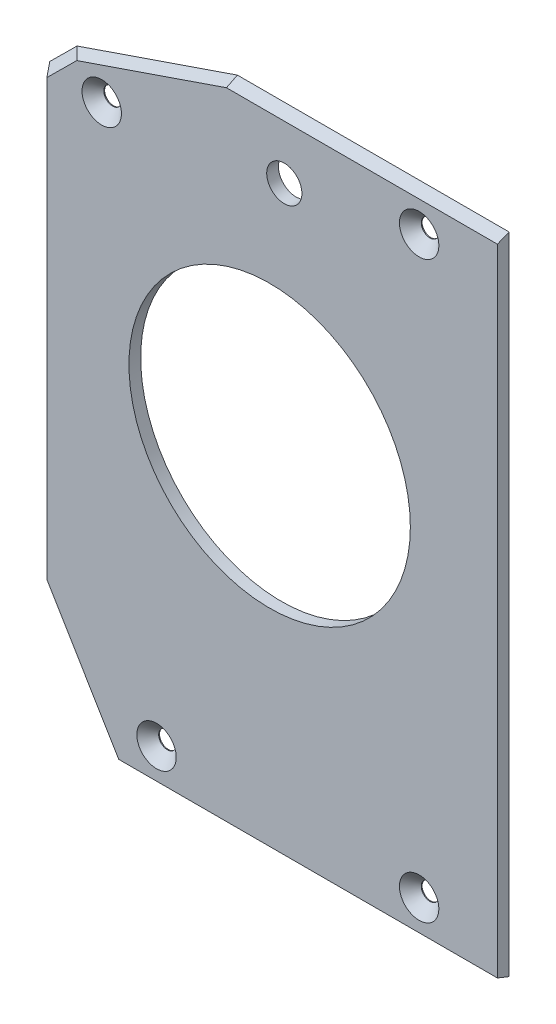
ISO-10303-21;
HEADER;
FILE_DESCRIPTION(('STEP AP214'),'2;1');
FILE_NAME('part.step','',(''),(''),'','','');
FILE_SCHEMA(('AUTOMOTIVE_DESIGN { 1 0 10303 214 1 1 1 1 }'));
ENDSEC;
DATA;
#1=APPLICATION_CONTEXT('core data for automotive mechanical design processes');
#2=APPLICATION_PROTOCOL_DEFINITION('international standard','automotive_design',2000,#1);
#3=PRODUCT_CONTEXT('',#1,'mechanical');
#4=PRODUCT('Part','Part','',(#3));
#5=PRODUCT_RELATED_PRODUCT_CATEGORY('part','',(#4));
#6=PRODUCT_DEFINITION_FORMATION('','',#4);
#7=PRODUCT_DEFINITION_CONTEXT('part definition',#1,'design');
#8=PRODUCT_DEFINITION('design','',#6,#7);
#9=PRODUCT_DEFINITION_SHAPE('','',#8);
#10=(LENGTH_UNIT() NAMED_UNIT(*) SI_UNIT(.MILLI.,.METRE.));
#11=(NAMED_UNIT(*) PLANE_ANGLE_UNIT() SI_UNIT($,.RADIAN.));
#12=(NAMED_UNIT(*) SI_UNIT($,.STERADIAN.) SOLID_ANGLE_UNIT());
#13=UNCERTAINTY_MEASURE_WITH_UNIT(LENGTH_MEASURE(1.E-05),#10,'distance_accuracy_value','');
#14=(GEOMETRIC_REPRESENTATION_CONTEXT(3) GLOBAL_UNCERTAINTY_ASSIGNED_CONTEXT((#13)) GLOBAL_UNIT_ASSIGNED_CONTEXT((#10,
#11,#12)) REPRESENTATION_CONTEXT('',''));
#15=CARTESIAN_POINT('',(0.,0.,0.));
#16=DIRECTION('',(0.,0.,1.));
#17=DIRECTION('',(1.,0.,0.));
#18=AXIS2_PLACEMENT_3D('',#15,#16,#17);
#19=CARTESIAN_POINT('',(38.85,0.,2.));
#20=DIRECTION('',(-1.,0.,0.));
#21=DIRECTION('',(0.,-1.,0.));
#22=AXIS2_PLACEMENT_3D('',#19,#20,#21);
#23=PLANE('',#22);
#24=DIRECTION('',(0.,1.,0.));
#25=VECTOR('',#24,1.);
#26=CARTESIAN_POINT('',(38.85,0.,2.));
#27=LINE('',#26,#25);
#28=CARTESIAN_POINT('',(38.85,-59.2,2.));
#29=VERTEX_POINT('',#28);
#30=CARTESIAN_POINT('',(38.85,49.2,2.));
#31=VERTEX_POINT('',#30);
#32=EDGE_CURVE('E141',#29,#31,#27,.T.);
#33=ORIENTED_EDGE('',*,*,#32,.F.);
#34=DIRECTION('',(0.,-0.371390676354102,-0.92847669088526));
#35=VECTOR('',#34,1.);
#36=CARTESIAN_POINT('',(38.85,-59.2,2.));
#37=LINE('',#36,#35);
#38=CARTESIAN_POINT('',(38.85,-60.,0.));
#39=VERTEX_POINT('',#38);
#40=EDGE_CURVE('E158',#29,#39,#37,.T.);
#41=ORIENTED_EDGE('',*,*,#40,.T.);
#42=DIRECTION('',(0.,1.,0.));
#43=VECTOR('',#42,1.);
#44=CARTESIAN_POINT('',(38.85,0.,0.));
#45=LINE('',#44,#43);
#46=CARTESIAN_POINT('',(38.85,50.,0.));
#47=VERTEX_POINT('',#46);
#48=EDGE_CURVE('E132',#39,#47,#45,.T.);
#49=ORIENTED_EDGE('',*,*,#48,.T.);
#50=DIRECTION('',(0.,-0.371390676354104,0.928476690885259));
#51=VECTOR('',#50,1.);
#52=CARTESIAN_POINT('',(38.85,49.2,2.));
#53=LINE('',#52,#51);
#54=EDGE_CURVE('E58',#47,#31,#53,.T.);
#55=ORIENTED_EDGE('',*,*,#54,.T.);
#56=EDGE_LOOP('',(#33,#41,#49,#55));
#57=FACE_BOUND('',#56,.T.);
#58=ADVANCED_FACE('F35',(#57),#23,.F.);
#59=CARTESIAN_POINT('',(0.,0.,2.));
#60=DIRECTION('',(0.,0.,-1.));
#61=DIRECTION('',(-1.,0.,0.));
#62=AXIS2_PLACEMENT_3D('',#59,#60,#61);
#63=CYLINDRICAL_SURFACE('',#62,24.);
#64=CARTESIAN_POINT('',(0.,0.,2.));
#65=DIRECTION('',(0.,0.,1.));
#66=DIRECTION('',(1.,0.,0.));
#67=AXIS2_PLACEMENT_3D('',#64,#65,#66);
#68=CIRCLE('',#67,24.);
#69=CARTESIAN_POINT('',(24.,0.,2.));
#70=VERTEX_POINT('',#69);
#71=EDGE_CURVE('E136',#70,#70,#68,.T.);
#72=ORIENTED_EDGE('',*,*,#71,.T.);
#73=EDGE_LOOP('',(#72));
#74=FACE_BOUND('',#73,.T.);
#75=CARTESIAN_POINT('',(0.,0.,0.));
#76=DIRECTION('',(0.,0.,1.));
#77=DIRECTION('',(1.,0.,0.));
#78=AXIS2_PLACEMENT_3D('',#75,#76,#77);
#79=CIRCLE('',#78,24.);
#80=CARTESIAN_POINT('',(24.,0.,0.));
#81=VERTEX_POINT('',#80);
#82=EDGE_CURVE('E118',#81,#81,#79,.T.);
#83=ORIENTED_EDGE('',*,*,#82,.F.);
#84=EDGE_LOOP('',(#83));
#85=FACE_BOUND('',#84,.T.);
#86=ADVANCED_FACE('F199',(#74,#85),#63,.F.);
#87=CARTESIAN_POINT('',(0.,0.,2.));
#88=DIRECTION('',(0.,0.,1.));
#89=DIRECTION('',(1.,0.,0.));
#90=AXIS2_PLACEMENT_3D('',#87,#88,#89);
#91=PLANE('',#90);
#92=CARTESIAN_POINT('',(-19.2911449838301,-54.,2.));
#93=DIRECTION('',(0.,0.,1.));
#94=DIRECTION('',(1.,0.,0.));
#95=AXIS2_PLACEMENT_3D('',#92,#93,#94);
#96=CIRCLE('',#95,3.36000000000003);
#97=CARTESIAN_POINT('',(-15.93114498383,-54.,2.));
#98=VERTEX_POINT('',#97);
#99=EDGE_CURVE('E174',#98,#98,#96,.F.);
#100=ORIENTED_EDGE('',*,*,#99,.T.);
#101=EDGE_LOOP('',(#100));
#102=FACE_BOUND('',#101,.T.);
#103=CARTESIAN_POINT('',(25.5,-54.,2.));
#104=DIRECTION('',(0.,0.,1.));
#105=DIRECTION('',(1.,0.,0.));
#106=AXIS2_PLACEMENT_3D('',#103,#104,#105);
#107=CIRCLE('',#106,3.36000000000003);
#108=CARTESIAN_POINT('',(28.8600000000001,-54.,2.));
#109=VERTEX_POINT('',#108);
#110=EDGE_CURVE('E171',#109,#109,#107,.F.);
#111=ORIENTED_EDGE('',*,*,#110,.T.);
#112=EDGE_LOOP('',(#111));
#113=FACE_BOUND('',#112,.T.);
#114=CARTESIAN_POINT('',(25.5,44.,2.));
#115=DIRECTION('',(0.,0.,1.));
#116=DIRECTION('',(1.,0.,0.));
#117=AXIS2_PLACEMENT_3D('',#114,#115,#116);
#118=CIRCLE('',#117,3.36000000000003);
#119=CARTESIAN_POINT('',(28.86,44.,2.));
#120=VERTEX_POINT('',#119);
#121=EDGE_CURVE('E168',#120,#120,#118,.F.);
#122=ORIENTED_EDGE('',*,*,#121,.T.);
#123=EDGE_LOOP('',(#122));
#124=FACE_BOUND('',#123,.T.);
#125=CARTESIAN_POINT('',(-28.6429216485271,36.4081411490764,2.));
#126=DIRECTION('',(0.,0.,1.));
#127=DIRECTION('',(1.,0.,0.));
#128=AXIS2_PLACEMENT_3D('',#125,#126,#127);
#129=CIRCLE('',#128,3.36000000000003);
#130=CARTESIAN_POINT('',(-25.282921648527,36.4081411490764,2.));
#131=VERTEX_POINT('',#130);
#132=EDGE_CURVE('E165',#131,#131,#129,.F.);
#133=ORIENTED_EDGE('',*,*,#132,.T.);
#134=EDGE_LOOP('',(#133));
#135=FACE_BOUND('',#134,.T.);
#136=CARTESIAN_POINT('',(2.50000000000002,40.,2.));
#137=DIRECTION('',(0.,0.,1.));
#138=DIRECTION('',(1.,0.,0.));
#139=AXIS2_PLACEMENT_3D('',#136,#137,#138);
#140=CIRCLE('',#139,3.);
#141=CARTESIAN_POINT('',(5.50000000000002,40.,2.));
#142=VERTEX_POINT('',#141);
#143=EDGE_CURVE('E247',#142,#142,#140,.T.);
#144=ORIENTED_EDGE('',*,*,#143,.F.);
#145=EDGE_LOOP('',(#144));
#146=FACE_BOUND('',#145,.T.);
#147=ORIENTED_EDGE('',*,*,#71,.F.);
#148=EDGE_LOOP('',(#147));
#149=FACE_BOUND('',#148,.T.);
#150=DIRECTION('',(0.514495755427526,-0.857492925712544,0.));
#151=VECTOR('',#150,1.);
#152=CARTESIAN_POINT('',(-25.715189474524,-59.2282563668587,2.));
#153=LINE('',#152,#151);
#154=CARTESIAN_POINT('',(-38.,-38.753572157732,2.));
#155=VERTEX_POINT('',#154);
#156=CARTESIAN_POINT('',(-25.7321432946392,-59.2,2.));
#157=VERTEX_POINT('',#156);
#158=EDGE_CURVE('E137',#155,#157,#153,.T.);
#159=ORIENTED_EDGE('',*,*,#158,.T.);
#160=DIRECTION('',(1.,0.,0.));
#161=VECTOR('',#160,1.);
#162=CARTESIAN_POINT('',(38.85,-59.2,2.));
#163=LINE('',#162,#161);
#164=EDGE_CURVE('E154',#157,#29,#163,.T.);
#165=ORIENTED_EDGE('',*,*,#164,.T.);
#166=ORIENTED_EDGE('',*,*,#32,.T.);
#167=DIRECTION('',(-1.,0.,0.));
#168=VECTOR('',#167,1.);
#169=CARTESIAN_POINT('',(-7.49999999999999,49.2,2.));
#170=LINE('',#169,#168);
#171=CARTESIAN_POINT('',(-7.36666666666669,49.2,2.));
#172=VERTEX_POINT('',#171);
#173=EDGE_CURVE('E151',#31,#172,#170,.T.);
#174=ORIENTED_EDGE('',*,*,#173,.T.);
#175=DIRECTION('',(-0.945945945945946,-0.324324324324324,0.));
#176=VECTOR('',#175,1.);
#177=CARTESIAN_POINT('',(-31.3288926112146,40.984379676155,2.));
#178=LINE('',#177,#176);
#179=CARTESIAN_POINT('',(-32.8936367655633,40.4478959660926,2.));
#180=VERTEX_POINT('',#179);
#181=EDGE_CURVE('E144',#172,#180,#178,.T.);
#182=ORIENTED_EDGE('',*,*,#181,.T.);
#183=DIRECTION('',(-0.710376607887829,-0.703821763634645,0.));
#184=VECTOR('',#183,1.);
#185=CARTESIAN_POINT('',(-38.444267354548,34.948482602751,2.));
#186=LINE('',#185,#184);
#187=CARTESIAN_POINT('',(-38.,35.3886505777819,2.));
#188=VERTEX_POINT('',#187);
#189=EDGE_CURVE('E104',#180,#188,#186,.T.);
#190=ORIENTED_EDGE('',*,*,#189,.T.);
#191=DIRECTION('',(0.,-1.,0.));
#192=VECTOR('',#191,1.);
#193=CARTESIAN_POINT('',(-38.,-39.1690481051547,2.));
#194=LINE('',#193,#192);
#195=EDGE_CURVE('E140',#188,#155,#194,.T.);
#196=ORIENTED_EDGE('',*,*,#195,.T.);
#197=EDGE_LOOP('',(#159,#165,#166,#174,#182,#190,#196));
#198=FACE_BOUND('',#197,.T.);
#199=ADVANCED_FACE('F204',(#102,#113,#124,#135,#146,#149,#198),#91,.T.);
#200=CARTESIAN_POINT('',(0.,0.,0.));
#201=DIRECTION('',(0.,0.,1.));
#202=DIRECTION('',(1.,0.,0.));
#203=AXIS2_PLACEMENT_3D('',#200,#201,#202);
#204=PLANE('',#203);
#205=CARTESIAN_POINT('',(-19.2911449838301,-54.,0.));
#206=DIRECTION('',(0.,0.,1.));
#207=DIRECTION('',(1.,0.,0.));
#208=AXIS2_PLACEMENT_3D('',#205,#206,#207);
#209=CIRCLE('',#208,1.5);
#210=CARTESIAN_POINT('',(-17.7911449838301,-54.,0.));
#211=VERTEX_POINT('',#210);
#212=EDGE_CURVE('E245',#211,#211,#209,.T.);
#213=ORIENTED_EDGE('',*,*,#212,.T.);
#214=EDGE_LOOP('',(#213));
#215=FACE_BOUND('',#214,.T.);
#216=CARTESIAN_POINT('',(25.5,-54.,0.));
#217=DIRECTION('',(0.,0.,1.));
#218=DIRECTION('',(1.,0.,0.));
#219=AXIS2_PLACEMENT_3D('',#216,#217,#218);
#220=CIRCLE('',#219,1.5);
#221=CARTESIAN_POINT('',(27.,-54.,0.));
#222=VERTEX_POINT('',#221);
#223=EDGE_CURVE('E248',#222,#222,#220,.T.);
#224=ORIENTED_EDGE('',*,*,#223,.T.);
#225=EDGE_LOOP('',(#224));
#226=FACE_BOUND('',#225,.T.);
#227=CARTESIAN_POINT('',(25.5,44.,0.));
#228=DIRECTION('',(0.,0.,1.));
#229=DIRECTION('',(1.,0.,0.));
#230=AXIS2_PLACEMENT_3D('',#227,#228,#229);
#231=CIRCLE('',#230,1.5);
#232=CARTESIAN_POINT('',(27.,44.,0.));
#233=VERTEX_POINT('',#232);
#234=EDGE_CURVE('E253',#233,#233,#231,.T.);
#235=ORIENTED_EDGE('',*,*,#234,.T.);
#236=EDGE_LOOP('',(#235));
#237=FACE_BOUND('',#236,.T.);
#238=CARTESIAN_POINT('',(-28.6429216485271,36.4081411490764,0.));
#239=DIRECTION('',(0.,0.,1.));
#240=DIRECTION('',(1.,0.,0.));
#241=AXIS2_PLACEMENT_3D('',#238,#239,#240);
#242=CIRCLE('',#241,1.5);
#243=CARTESIAN_POINT('',(-27.1429216485271,36.4081411490764,0.));
#244=VERTEX_POINT('',#243);
#245=EDGE_CURVE('E162',#244,#244,#242,.T.);
#246=ORIENTED_EDGE('',*,*,#245,.T.);
#247=EDGE_LOOP('',(#246));
#248=FACE_BOUND('',#247,.T.);
#249=CARTESIAN_POINT('',(2.50000000000002,40.,0.));
#250=DIRECTION('',(0.,0.,1.));
#251=DIRECTION('',(1.,0.,0.));
#252=AXIS2_PLACEMENT_3D('',#249,#250,#251);
#253=CIRCLE('',#252,3.);
#254=CARTESIAN_POINT('',(5.50000000000002,40.,0.));
#255=VERTEX_POINT('',#254);
#256=EDGE_CURVE('E147',#255,#255,#253,.T.);
#257=ORIENTED_EDGE('',*,*,#256,.T.);
#258=EDGE_LOOP('',(#257));
#259=FACE_BOUND('',#258,.T.);
#260=ORIENTED_EDGE('',*,*,#82,.T.);
#261=EDGE_LOOP('',(#260));
#262=FACE_BOUND('',#261,.T.);
#263=DIRECTION('',(-0.945945945945946,-0.324324324324324,0.));
#264=VECTOR('',#263,1.);
#265=CARTESIAN_POINT('',(-16.1285609934259,47.0416362308254,0.));
#266=LINE('',#265,#264);
#267=CARTESIAN_POINT('',(-7.49999999999999,50.,0.));
#268=VERTEX_POINT('',#267);
#269=CARTESIAN_POINT('',(-34.84735076163,40.6237654531554,0.));
#270=VERTEX_POINT('',#269);
#271=EDGE_CURVE('E113',#268,#270,#266,.T.);
#272=ORIENTED_EDGE('',*,*,#271,.F.);
#273=DIRECTION('',(-1.,0.,0.));
#274=VECTOR('',#273,1.);
#275=CARTESIAN_POINT('',(0.,50.,0.));
#276=LINE('',#275,#274);
#277=EDGE_CURVE('E134',#47,#268,#276,.T.);
#278=ORIENTED_EDGE('',*,*,#277,.F.);
#279=ORIENTED_EDGE('',*,*,#48,.F.);
#280=DIRECTION('',(1.,0.,0.));
#281=VECTOR('',#280,1.);
#282=CARTESIAN_POINT('',(0.,-60.,0.));
#283=LINE('',#282,#281);
#284=CARTESIAN_POINT('',(-27.0014288630928,-60.,0.));
#285=VERTEX_POINT('',#284);
#286=EDGE_CURVE('E129',#285,#39,#283,.T.);
#287=ORIENTED_EDGE('',*,*,#286,.F.);
#288=DIRECTION('',(0.514495755427526,-0.857492925712544,0.));
#289=VECTOR('',#288,1.);
#290=CARTESIAN_POINT('',(-46.3245800463918,-27.794748027835,0.));
#291=LINE('',#290,#289);
#292=CARTESIAN_POINT('',(-39.5,-39.1690481051547,0.));
#293=VERTEX_POINT('',#292);
#294=EDGE_CURVE('E126',#293,#285,#291,.T.);
#295=ORIENTED_EDGE('',*,*,#294,.F.);
#296=DIRECTION('',(0.,-1.,0.));
#297=VECTOR('',#296,1.);
#298=CARTESIAN_POINT('',(-39.5,0.,0.));
#299=LINE('',#298,#297);
#300=CARTESIAN_POINT('',(-39.5,36.0140475145827,0.));
#301=VERTEX_POINT('',#300);
#302=EDGE_CURVE('E115',#301,#293,#299,.T.);
#303=ORIENTED_EDGE('',*,*,#302,.F.);
#304=DIRECTION('',(-0.710376607887829,-0.703821763634645,0.));
#305=VECTOR('',#304,1.);
#306=CARTESIAN_POINT('',(-37.5731705289598,37.9230975895323,0.));
#307=LINE('',#306,#305);
#308=EDGE_CURVE('E102',#270,#301,#307,.T.);
#309=ORIENTED_EDGE('',*,*,#308,.F.);
#310=EDGE_LOOP('',(#272,#278,#279,#287,#295,#303,#309));
#311=FACE_BOUND('',#310,.T.);
#312=ADVANCED_FACE('F111',(#215,#226,#237,#248,#259,#262,#311),#204,.F.);
#313=CARTESIAN_POINT('',(-45.0383406578229,-27.0230043946937,2.));
#314=DIRECTION('',(-0.685994340570034,-0.41159660434202,0.600000000000003));
#315=DIRECTION('',(-0.514495755427526,0.857492925712544,0.));
#316=AXIS2_PLACEMENT_3D('',#313,#314,#315);
#317=PLANE('',#316);
#318=ORIENTED_EDGE('',*,*,#294,.T.);
#319=DIRECTION('',(0.507670128833979,0.31997220575192,0.799930514379806));
#320=VECTOR('',#319,1.);
#321=CARTESIAN_POINT('',(-25.4810676429617,-59.0417530882458,2.39561727938551));
#322=LINE('',#321,#320);
#323=EDGE_CURVE('E108',#285,#157,#322,.T.);
#324=ORIENTED_EDGE('',*,*,#323,.T.);
#325=ORIENTED_EDGE('',*,*,#158,.F.);
#326=DIRECTION('',(-0.591882005245555,-0.163941824594552,-0.789176006994073));
#327=VECTOR('',#326,1.);
#328=CARTESIAN_POINT('',(-39.3274353765916,-39.1212504715532,0.230086164544438));
#329=LINE('',#328,#327);
#330=EDGE_CURVE('E121',#293,#155,#329,.F.);
#331=ORIENTED_EDGE('',*,*,#330,.F.);
#332=EDGE_LOOP('',(#318,#324,#325,#331));
#333=FACE_BOUND('',#332,.T.);
#334=ADVANCED_FACE('F216',(#333),#317,.T.);
#335=CARTESIAN_POINT('',(-38.,0.,2.));
#336=DIRECTION('',(-0.8,0.,0.6));
#337=DIRECTION('',(0.,1.,0.));
#338=AXIS2_PLACEMENT_3D('',#335,#336,#337);
#339=PLANE('',#338);
#340=ORIENTED_EDGE('',*,*,#330,.T.);
#341=ORIENTED_EDGE('',*,*,#195,.F.);
#342=DIRECTION('',(-0.5820637484099,0.242680590185587,-0.776084997879867));
#343=VECTOR('',#342,1.);
#344=CARTESIAN_POINT('',(-33.0011558499127,33.3044760317755,8.66512553344967));
#345=LINE('',#344,#343);
#346=EDGE_CURVE('E145',#301,#188,#345,.F.);
#347=ORIENTED_EDGE('',*,*,#346,.F.);
#348=ORIENTED_EDGE('',*,*,#302,.T.);
#349=EDGE_LOOP('',(#340,#341,#347,#348));
#350=FACE_BOUND('',#349,.T.);
#351=ADVANCED_FACE('F213',(#350),#339,.T.);
#352=CARTESIAN_POINT('',(-36.5174378835078,36.8575326777006,2.));
#353=DIRECTION('',(-0.563057410907716,0.568301286310262,0.600000000000001));
#354=DIRECTION('',(0.710376607887829,0.703821763634645,0.));
#355=AXIS2_PLACEMENT_3D('',#352,#353,#354);
#356=PLANE('',#355);
#357=ORIENTED_EDGE('',*,*,#189,.F.);
#358=DIRECTION('',(-0.697402452251251,0.06277879556616,-0.71392481566423));
#359=VECTOR('',#358,1.);
#360=CARTESIAN_POINT('',(-34.4989519748719,40.5924032803687,0.356652803286004));
#361=LINE('',#360,#359);
#362=EDGE_CURVE('E98',#180,#270,#361,.T.);
#363=ORIENTED_EDGE('',*,*,#362,.T.);
#364=ORIENTED_EDGE('',*,*,#308,.T.);
#365=ORIENTED_EDGE('',*,*,#346,.T.);
#366=EDGE_LOOP('',(#357,#363,#364,#365));
#367=FACE_BOUND('',#366,.T.);
#368=ADVANCED_FACE('F100',(#367),#356,.T.);
#369=CARTESIAN_POINT('',(2.50000000000002,40.,0.));
#370=DIRECTION('',(0.,0.,1.));
#371=DIRECTION('',(1.,0.,0.));
#372=AXIS2_PLACEMENT_3D('',#369,#370,#371);
#373=CYLINDRICAL_SURFACE('',#372,3.);
#374=ORIENTED_EDGE('',*,*,#256,.F.);
#375=EDGE_LOOP('',(#374));
#376=FACE_BOUND('',#375,.T.);
#377=ORIENTED_EDGE('',*,*,#143,.T.);
#378=EDGE_LOOP('',(#377));
#379=FACE_BOUND('',#378,.T.);
#380=ADVANCED_FACE('F212',(#376,#379),#373,.F.);
#381=CARTESIAN_POINT('',(-28.6429216485271,36.4081411490764,0.));
#382=DIRECTION('',(0.,0.,1.));
#383=DIRECTION('',(1.,0.,0.));
#384=AXIS2_PLACEMENT_3D('',#381,#382,#383);
#385=CYLINDRICAL_SURFACE('',#384,1.5);
#386=CARTESIAN_POINT('',(-28.6429216485271,36.4081411490764,0.13999999999998));
#387=DIRECTION('',(0.,0.,1.));
#388=DIRECTION('',(1.,0.,0.));
#389=AXIS2_PLACEMENT_3D('',#386,#387,#388);
#390=CIRCLE('',#389,1.5);
#391=CARTESIAN_POINT('',(-27.1429216485271,36.4081411490764,0.13999999999998));
#392=VERTEX_POINT('',#391);
#393=EDGE_CURVE('E11',#392,#392,#390,.T.);
#394=ORIENTED_EDGE('',*,*,#393,.T.);
#395=EDGE_LOOP('',(#394));
#396=FACE_BOUND('',#395,.T.);
#397=ORIENTED_EDGE('',*,*,#245,.F.);
#398=EDGE_LOOP('',(#397));
#399=FACE_BOUND('',#398,.T.);
#400=ADVANCED_FACE('F279',(#396,#399),#385,.F.);
#401=CARTESIAN_POINT('',(25.5,44.,0.));
#402=DIRECTION('',(0.,0.,1.));
#403=DIRECTION('',(1.,0.,0.));
#404=AXIS2_PLACEMENT_3D('',#401,#402,#403);
#405=CYLINDRICAL_SURFACE('',#404,1.5);
#406=CARTESIAN_POINT('',(25.5,44.,0.13999999999998));
#407=DIRECTION('',(0.,0.,1.));
#408=DIRECTION('',(1.,0.,0.));
#409=AXIS2_PLACEMENT_3D('',#406,#407,#408);
#410=CIRCLE('',#409,1.5);
#411=CARTESIAN_POINT('',(27.,44.,0.13999999999998));
#412=VERTEX_POINT('',#411);
#413=EDGE_CURVE('E43',#412,#412,#410,.T.);
#414=ORIENTED_EDGE('',*,*,#413,.T.);
#415=EDGE_LOOP('',(#414));
#416=FACE_BOUND('',#415,.T.);
#417=ORIENTED_EDGE('',*,*,#234,.F.);
#418=EDGE_LOOP('',(#417));
#419=FACE_BOUND('',#418,.T.);
#420=ADVANCED_FACE('F182',(#416,#419),#405,.F.);
#421=CARTESIAN_POINT('',(25.5,-54.,0.));
#422=DIRECTION('',(0.,0.,1.));
#423=DIRECTION('',(1.,0.,0.));
#424=AXIS2_PLACEMENT_3D('',#421,#422,#423);
#425=CYLINDRICAL_SURFACE('',#424,1.5);
#426=CARTESIAN_POINT('',(25.5,-54.,0.13999999999998));
#427=DIRECTION('',(0.,0.,1.));
#428=DIRECTION('',(1.,0.,0.));
#429=AXIS2_PLACEMENT_3D('',#426,#427,#428);
#430=CIRCLE('',#429,1.5);
#431=CARTESIAN_POINT('',(27.,-54.,0.13999999999998));
#432=VERTEX_POINT('',#431);
#433=EDGE_CURVE('E177',#432,#432,#430,.T.);
#434=ORIENTED_EDGE('',*,*,#433,.T.);
#435=EDGE_LOOP('',(#434));
#436=FACE_BOUND('',#435,.T.);
#437=ORIENTED_EDGE('',*,*,#223,.F.);
#438=EDGE_LOOP('',(#437));
#439=FACE_BOUND('',#438,.T.);
#440=ADVANCED_FACE('F241',(#436,#439),#425,.F.);
#441=CARTESIAN_POINT('',(-19.2911449838301,-54.,0.));
#442=DIRECTION('',(0.,0.,1.));
#443=DIRECTION('',(1.,0.,0.));
#444=AXIS2_PLACEMENT_3D('',#441,#442,#443);
#445=CYLINDRICAL_SURFACE('',#444,1.5);
#446=CARTESIAN_POINT('',(-19.2911449838301,-54.,0.13999999999998));
#447=DIRECTION('',(0.,0.,1.));
#448=DIRECTION('',(1.,0.,0.));
#449=AXIS2_PLACEMENT_3D('',#446,#447,#448);
#450=CIRCLE('',#449,1.5);
#451=CARTESIAN_POINT('',(-17.7911449838301,-54.,0.13999999999998));
#452=VERTEX_POINT('',#451);
#453=EDGE_CURVE('E107',#452,#452,#450,.T.);
#454=ORIENTED_EDGE('',*,*,#453,.T.);
#455=EDGE_LOOP('',(#454));
#456=FACE_BOUND('',#455,.T.);
#457=ORIENTED_EDGE('',*,*,#212,.F.);
#458=EDGE_LOOP('',(#457));
#459=FACE_BOUND('',#458,.T.);
#460=ADVANCED_FACE('F224',(#456,#459),#445,.F.);
#461=CARTESIAN_POINT('',(0.,-59.2,2.));
#462=DIRECTION('',(0.,-0.92847669088526,0.371390676354102));
#463=DIRECTION('',(-1.,0.,0.));
#464=AXIS2_PLACEMENT_3D('',#461,#462,#463);
#465=PLANE('',#464);
#466=ORIENTED_EDGE('',*,*,#323,.F.);
#467=ORIENTED_EDGE('',*,*,#286,.T.);
#468=ORIENTED_EDGE('',*,*,#40,.F.);
#469=ORIENTED_EDGE('',*,*,#164,.F.);
#470=EDGE_LOOP('',(#466,#467,#468,#469));
#471=FACE_BOUND('',#470,.T.);
#472=ADVANCED_FACE('F221',(#471),#465,.T.);
#473=CARTESIAN_POINT('',(-15.8691015339664,46.2848794740687,2.));
#474=DIRECTION('',(-0.301127575422246,0.878288761648218,0.371390676354104));
#475=DIRECTION('',(0.945945945945946,0.324324324324324,0.));
#476=AXIS2_PLACEMENT_3D('',#473,#474,#475);
#477=PLANE('',#476);
#478=ORIENTED_EDGE('',*,*,#362,.F.);
#479=ORIENTED_EDGE('',*,*,#181,.F.);
#480=DIRECTION('',(-0.06178020632152,0.37068123792913,-0.926703094822823));
#481=VECTOR('',#480,1.);
#482=CARTESIAN_POINT('',(-7.33236022281826,48.9941613369094,2.51459665772644));
#483=LINE('',#482,#481);
#484=EDGE_CURVE('E50',#268,#172,#483,.F.);
#485=ORIENTED_EDGE('',*,*,#484,.F.);
#486=ORIENTED_EDGE('',*,*,#271,.T.);
#487=EDGE_LOOP('',(#478,#479,#485,#486));
#488=FACE_BOUND('',#487,.T.);
#489=ADVANCED_FACE('F117',(#488),#477,.T.);
#490=CARTESIAN_POINT('',(0.,49.2,2.));
#491=DIRECTION('',(0.,0.928476690885259,0.371390676354104));
#492=DIRECTION('',(1.,0.,0.));
#493=AXIS2_PLACEMENT_3D('',#490,#491,#492);
#494=PLANE('',#493);
#495=ORIENTED_EDGE('',*,*,#54,.F.);
#496=ORIENTED_EDGE('',*,*,#277,.T.);
#497=ORIENTED_EDGE('',*,*,#484,.T.);
#498=ORIENTED_EDGE('',*,*,#173,.F.);
#499=EDGE_LOOP('',(#495,#496,#497,#498));
#500=FACE_BOUND('',#499,.T.);
#501=ADVANCED_FACE('F226',(#500),#494,.T.);
#502=CARTESIAN_POINT('',(-19.2911449838301,-54.,0.13999999999998));
#503=DIRECTION('',(0.,0.,1.));
#504=DIRECTION('',(1.,0.,0.));
#505=AXIS2_PLACEMENT_3D('',#502,#503,#504);
#506=CONICAL_SURFACE('',#505,1.5,0.785398163397451);
#507=ORIENTED_EDGE('',*,*,#99,.F.);
#508=EDGE_LOOP('',(#507));
#509=FACE_BOUND('',#508,.T.);
#510=ORIENTED_EDGE('',*,*,#453,.F.);
#511=EDGE_LOOP('',(#510));
#512=FACE_BOUND('',#511,.T.);
#513=ADVANCED_FACE('F194',(#509,#512),#506,.F.);
#514=CARTESIAN_POINT('',(25.5,-54.,0.13999999999998));
#515=DIRECTION('',(0.,0.,1.));
#516=DIRECTION('',(1.,0.,0.));
#517=AXIS2_PLACEMENT_3D('',#514,#515,#516);
#518=CONICAL_SURFACE('',#517,1.5,0.785398163397451);
#519=ORIENTED_EDGE('',*,*,#110,.F.);
#520=EDGE_LOOP('',(#519));
#521=FACE_BOUND('',#520,.T.);
#522=ORIENTED_EDGE('',*,*,#433,.F.);
#523=EDGE_LOOP('',(#522));
#524=FACE_BOUND('',#523,.T.);
#525=ADVANCED_FACE('F187',(#521,#524),#518,.F.);
#526=CARTESIAN_POINT('',(25.5,44.,0.13999999999998));
#527=DIRECTION('',(0.,0.,1.));
#528=DIRECTION('',(1.,0.,0.));
#529=AXIS2_PLACEMENT_3D('',#526,#527,#528);
#530=CONICAL_SURFACE('',#529,1.5,0.785398163397451);
#531=ORIENTED_EDGE('',*,*,#121,.F.);
#532=EDGE_LOOP('',(#531));
#533=FACE_BOUND('',#532,.T.);
#534=ORIENTED_EDGE('',*,*,#413,.F.);
#535=EDGE_LOOP('',(#534));
#536=FACE_BOUND('',#535,.T.);
#537=ADVANCED_FACE('F185',(#533,#536),#530,.F.);
#538=CARTESIAN_POINT('',(-28.6429216485271,36.4081411490764,0.13999999999998));
#539=DIRECTION('',(0.,0.,1.));
#540=DIRECTION('',(1.,0.,0.));
#541=AXIS2_PLACEMENT_3D('',#538,#539,#540);
#542=CONICAL_SURFACE('',#541,1.5,0.78539816339745);
#543=ORIENTED_EDGE('',*,*,#132,.F.);
#544=EDGE_LOOP('',(#543));
#545=FACE_BOUND('',#544,.T.);
#546=ORIENTED_EDGE('',*,*,#393,.F.);
#547=EDGE_LOOP('',(#546));
#548=FACE_BOUND('',#547,.T.);
#549=ADVANCED_FACE('F37',(#545,#548),#542,.F.);
#550=CLOSED_SHELL('',(#58,#86,#199,#312,#334,#351,#368,#380,#400,#420,#440,#460,#472,#489,#501,
#513,#525,#537,#549));
#551=MANIFOLD_SOLID_BREP('B2',#550);
#552=ADVANCED_BREP_SHAPE_REPRESENTATION('',(#18,#551),#14);
#553=SHAPE_DEFINITION_REPRESENTATION(#9,#552);
ENDSEC;
END-ISO-10303-21;
